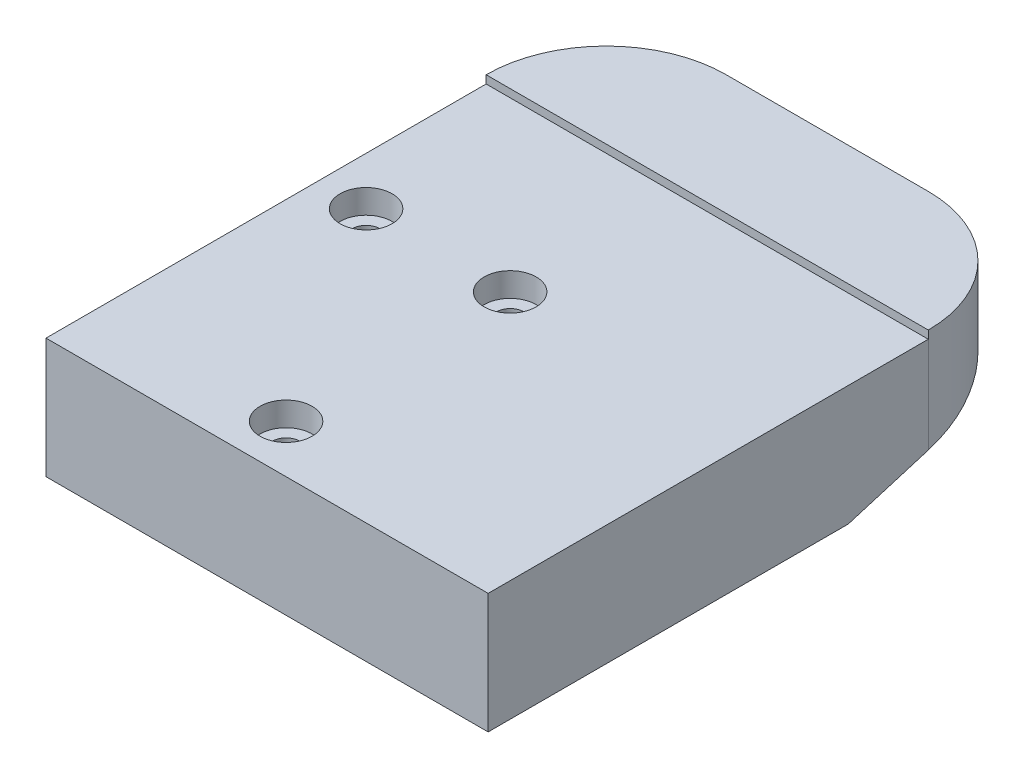
ISO-10303-21;
HEADER;
FILE_DESCRIPTION(('STEP AP214'),'2;1');
FILE_NAME('part.step','',(''),(''),'','','');
FILE_SCHEMA(('AUTOMOTIVE_DESIGN { 1 0 10303 214 1 1 1 1 }'));
ENDSEC;
DATA;
#1=APPLICATION_CONTEXT('core data for automotive mechanical design processes');
#2=APPLICATION_PROTOCOL_DEFINITION('international standard','automotive_design',2000,#1);
#3=PRODUCT_CONTEXT('',#1,'mechanical');
#4=PRODUCT('Part','Part','',(#3));
#5=PRODUCT_RELATED_PRODUCT_CATEGORY('part','',(#4));
#6=PRODUCT_DEFINITION_FORMATION('','',#4);
#7=PRODUCT_DEFINITION_CONTEXT('part definition',#1,'design');
#8=PRODUCT_DEFINITION('design','',#6,#7);
#9=PRODUCT_DEFINITION_SHAPE('','',#8);
#10=(LENGTH_UNIT() NAMED_UNIT(*) SI_UNIT(.MILLI.,.METRE.));
#11=(NAMED_UNIT(*) PLANE_ANGLE_UNIT() SI_UNIT($,.RADIAN.));
#12=(NAMED_UNIT(*) SI_UNIT($,.STERADIAN.) SOLID_ANGLE_UNIT());
#13=UNCERTAINTY_MEASURE_WITH_UNIT(LENGTH_MEASURE(1.E-05),#10,'distance_accuracy_value','');
#14=(GEOMETRIC_REPRESENTATION_CONTEXT(3) GLOBAL_UNCERTAINTY_ASSIGNED_CONTEXT((#13)) GLOBAL_UNIT_ASSIGNED_CONTEXT((#10,
#11,#12)) REPRESENTATION_CONTEXT('',''));
#15=CARTESIAN_POINT('',(0.,0.,0.));
#16=DIRECTION('',(0.,0.,1.));
#17=DIRECTION('',(1.,0.,0.));
#18=AXIS2_PLACEMENT_3D('',#15,#16,#17);
#19=CARTESIAN_POINT('',(15.,15.,-55.));
#20=DIRECTION('',(0.,-1.,0.));
#21=DIRECTION('',(0.,0.,-1.));
#22=AXIS2_PLACEMENT_3D('',#19,#20,#21);
#23=PLANE('',#22);
#24=CARTESIAN_POINT('',(24.,15.,-6.00000000000001));
#25=DIRECTION('',(0.,1.,0.));
#26=DIRECTION('',(0.,0.,1.));
#27=AXIS2_PLACEMENT_3D('',#24,#25,#26);
#28=CIRCLE('',#27,3.25);
#29=CARTESIAN_POINT('',(24.,15.,-2.75000000000001));
#30=VERTEX_POINT('',#29);
#31=EDGE_CURVE('E182',#30,#30,#28,.T.);
#32=ORIENTED_EDGE('',*,*,#31,.F.);
#33=EDGE_LOOP('',(#32));
#34=FACE_BOUND('',#33,.T.);
#35=CARTESIAN_POINT('',(24.,15.,-34.));
#36=DIRECTION('',(0.,1.,0.));
#37=DIRECTION('',(0.,0.,1.));
#38=AXIS2_PLACEMENT_3D('',#35,#36,#37);
#39=CIRCLE('',#38,3.25);
#40=CARTESIAN_POINT('',(24.,15.,-30.75));
#41=VERTEX_POINT('',#40);
#42=EDGE_CURVE('E170',#41,#41,#39,.T.);
#43=ORIENTED_EDGE('',*,*,#42,.F.);
#44=EDGE_LOOP('',(#43));
#45=FACE_BOUND('',#44,.T.);
#46=CARTESIAN_POINT('',(6.,15.,-34.));
#47=DIRECTION('',(0.,1.,0.));
#48=DIRECTION('',(0.,0.,1.));
#49=AXIS2_PLACEMENT_3D('',#46,#47,#48);
#50=CIRCLE('',#49,3.25);
#51=CARTESIAN_POINT('',(6.,15.,-30.75));
#52=VERTEX_POINT('',#51);
#53=EDGE_CURVE('E157',#52,#52,#50,.T.);
#54=ORIENTED_EDGE('',*,*,#53,.F.);
#55=EDGE_LOOP('',(#54));
#56=FACE_BOUND('',#55,.T.);
#57=DIRECTION('',(1.,0.,0.));
#58=VECTOR('',#57,1.);
#59=CARTESIAN_POINT('',(0.,15.,-55.));
#60=LINE('',#59,#58);
#61=CARTESIAN_POINT('',(0.,15.,-54.9999999999999));
#62=VERTEX_POINT('',#61);
#63=CARTESIAN_POINT('',(55.25,15.,-54.9999999999999));
#64=VERTEX_POINT('',#63);
#65=EDGE_CURVE('E68',#62,#64,#60,.T.);
#66=ORIENTED_EDGE('',*,*,#65,.F.);
#67=DIRECTION('',(0.,0.,1.));
#68=VECTOR('',#67,1.);
#69=CARTESIAN_POINT('',(0.,15.,0.));
#70=LINE('',#69,#68);
#71=CARTESIAN_POINT('',(0.,15.,0.));
#72=VERTEX_POINT('',#71);
#73=EDGE_CURVE('E195',#62,#72,#70,.T.);
#74=ORIENTED_EDGE('',*,*,#73,.T.);
#75=DIRECTION('',(1.,0.,0.));
#76=VECTOR('',#75,1.);
#77=CARTESIAN_POINT('',(0.,15.,0.));
#78=LINE('',#77,#76);
#79=CARTESIAN_POINT('',(55.25,15.,0.));
#80=VERTEX_POINT('',#79);
#81=EDGE_CURVE('E86',#72,#80,#78,.T.);
#82=ORIENTED_EDGE('',*,*,#81,.T.);
#83=DIRECTION('',(0.,0.,-1.));
#84=VECTOR('',#83,1.);
#85=CARTESIAN_POINT('',(55.25,15.,0.));
#86=LINE('',#85,#84);
#87=EDGE_CURVE('E199',#80,#64,#86,.T.);
#88=ORIENTED_EDGE('',*,*,#87,.T.);
#89=EDGE_LOOP('',(#66,#74,#82,#88));
#90=FACE_BOUND('',#89,.T.);
#91=ADVANCED_FACE('F44',(#34,#45,#56,#90),#23,.F.);
#92=CARTESIAN_POINT('',(15.,0.,-55.));
#93=DIRECTION('',(0.,-1.,0.));
#94=DIRECTION('',(0.,0.,-1.));
#95=AXIS2_PLACEMENT_3D('',#92,#93,#94);
#96=PLANE('',#95);
#97=DIRECTION('',(-1.,0.,0.));
#98=VECTOR('',#97,1.);
#99=CARTESIAN_POINT('',(55.251,0.,-45.));
#100=LINE('',#99,#98);
#101=CARTESIAN_POINT('',(55.25,0.,-45.));
#102=VERTEX_POINT('',#101);
#103=CARTESIAN_POINT('',(0.,0.,-45.));
#104=VERTEX_POINT('',#103);
#105=EDGE_CURVE('E153',#102,#104,#100,.T.);
#106=ORIENTED_EDGE('',*,*,#105,.F.);
#107=DIRECTION('',(0.,0.,-1.));
#108=VECTOR('',#107,1.);
#109=CARTESIAN_POINT('',(55.25,0.,0.));
#110=LINE('',#109,#108);
#111=CARTESIAN_POINT('',(55.25,0.,0.));
#112=VERTEX_POINT('',#111);
#113=EDGE_CURVE('E197',#112,#102,#110,.T.);
#114=ORIENTED_EDGE('',*,*,#113,.F.);
#115=DIRECTION('',(1.,0.,0.));
#116=VECTOR('',#115,1.);
#117=CARTESIAN_POINT('',(0.,0.,0.));
#118=LINE('',#117,#116);
#119=CARTESIAN_POINT('',(0.,0.,0.));
#120=VERTEX_POINT('',#119);
#121=EDGE_CURVE('E83',#120,#112,#118,.T.);
#122=ORIENTED_EDGE('',*,*,#121,.F.);
#123=DIRECTION('',(0.,0.,1.));
#124=VECTOR('',#123,1.);
#125=CARTESIAN_POINT('',(0.,0.,0.));
#126=LINE('',#125,#124);
#127=EDGE_CURVE('E194',#104,#120,#126,.T.);
#128=ORIENTED_EDGE('',*,*,#127,.F.);
#129=EDGE_LOOP('',(#106,#114,#122,#128));
#130=FACE_BOUND('',#129,.T.);
#131=CARTESIAN_POINT('',(6.,0.,-34.));
#132=DIRECTION('',(0.,1.,0.));
#133=DIRECTION('',(0.,0.,1.));
#134=AXIS2_PLACEMENT_3D('',#131,#132,#133);
#135=CIRCLE('',#134,1.7);
#136=CARTESIAN_POINT('',(6.,0.,-32.3));
#137=VERTEX_POINT('',#136);
#138=EDGE_CURVE('E167',#137,#137,#135,.T.);
#139=ORIENTED_EDGE('',*,*,#138,.T.);
#140=EDGE_LOOP('',(#139));
#141=FACE_BOUND('',#140,.T.);
#142=CARTESIAN_POINT('',(24.,0.,-34.));
#143=DIRECTION('',(0.,1.,0.));
#144=DIRECTION('',(0.,0.,1.));
#145=AXIS2_PLACEMENT_3D('',#142,#143,#144);
#146=CIRCLE('',#145,1.7);
#147=CARTESIAN_POINT('',(24.,0.,-32.3));
#148=VERTEX_POINT('',#147);
#149=EDGE_CURVE('E179',#148,#148,#146,.T.);
#150=ORIENTED_EDGE('',*,*,#149,.T.);
#151=EDGE_LOOP('',(#150));
#152=FACE_BOUND('',#151,.T.);
#153=CARTESIAN_POINT('',(24.,0.,-6.00000000000001));
#154=DIRECTION('',(0.,1.,0.));
#155=DIRECTION('',(0.,0.,1.));
#156=AXIS2_PLACEMENT_3D('',#153,#154,#155);
#157=CIRCLE('',#156,1.7);
#158=CARTESIAN_POINT('',(24.,0.,-4.30000000000002));
#159=VERTEX_POINT('',#158);
#160=EDGE_CURVE('E191',#159,#159,#157,.T.);
#161=ORIENTED_EDGE('',*,*,#160,.T.);
#162=EDGE_LOOP('',(#161));
#163=FACE_BOUND('',#162,.T.);
#164=ADVANCED_FACE('F220',(#130,#141,#152,#163),#96,.T.);
#165=CARTESIAN_POINT('',(0.,15.,0.));
#166=DIRECTION('',(1.,0.,0.));
#167=DIRECTION('',(0.,0.,-1.));
#168=AXIS2_PLACEMENT_3D('',#165,#166,#167);
#169=PLANE('',#168);
#170=DIRECTION('',(0.,-1.,0.));
#171=VECTOR('',#170,1.);
#172=CARTESIAN_POINT('',(0.,15.,-54.9999999999999));
#173=LINE('',#172,#171);
#174=CARTESIAN_POINT('',(0.,3.,-54.9999999999999));
#175=VERTEX_POINT('',#174);
#176=EDGE_CURVE('E140',#62,#175,#173,.T.);
#177=ORIENTED_EDGE('',*,*,#176,.T.);
#178=DIRECTION('',(0.,0.287347885566345,-0.957826285221151));
#179=VECTOR('',#178,1.);
#180=CARTESIAN_POINT('',(0.,0.,-45.));
#181=LINE('',#180,#179);
#182=EDGE_CURVE('E59',#104,#175,#181,.T.);
#183=ORIENTED_EDGE('',*,*,#182,.F.);
#184=ORIENTED_EDGE('',*,*,#127,.T.);
#185=DIRECTION('',(0.,-1.,0.));
#186=VECTOR('',#185,1.);
#187=CARTESIAN_POINT('',(0.,15.,0.));
#188=LINE('',#187,#186);
#189=EDGE_CURVE('E11',#72,#120,#188,.T.);
#190=ORIENTED_EDGE('',*,*,#189,.F.);
#191=ORIENTED_EDGE('',*,*,#73,.F.);
#192=EDGE_LOOP('',(#177,#183,#184,#190,#191));
#193=FACE_BOUND('',#192,.T.);
#194=ADVANCED_FACE('F46',(#193),#169,.F.);
#195=CARTESIAN_POINT('',(0.,15.,0.));
#196=DIRECTION('',(0.,0.,-1.));
#197=DIRECTION('',(-1.,0.,0.));
#198=AXIS2_PLACEMENT_3D('',#195,#196,#197);
#199=PLANE('',#198);
#200=ORIENTED_EDGE('',*,*,#121,.T.);
#201=DIRECTION('',(0.,-1.,0.));
#202=VECTOR('',#201,1.);
#203=CARTESIAN_POINT('',(55.25,15.,0.));
#204=LINE('',#203,#202);
#205=EDGE_CURVE('E52',#80,#112,#204,.T.);
#206=ORIENTED_EDGE('',*,*,#205,.F.);
#207=ORIENTED_EDGE('',*,*,#81,.F.);
#208=ORIENTED_EDGE('',*,*,#189,.T.);
#209=EDGE_LOOP('',(#200,#206,#207,#208));
#210=FACE_BOUND('',#209,.T.);
#211=ADVANCED_FACE('F367',(#210),#199,.F.);
#212=CARTESIAN_POINT('',(55.25,15.,0.));
#213=DIRECTION('',(-1.,0.,0.));
#214=DIRECTION('',(0.,0.,1.));
#215=AXIS2_PLACEMENT_3D('',#212,#213,#214);
#216=PLANE('',#215);
#217=ORIENTED_EDGE('',*,*,#113,.T.);
#218=DIRECTION('',(0.,-0.287347885566345,0.957826285221152));
#219=VECTOR('',#218,1.);
#220=CARTESIAN_POINT('',(55.25,0.,-45.));
#221=LINE('',#220,#219);
#222=CARTESIAN_POINT('',(55.25,2.99999999999997,-54.9999999999999));
#223=VERTEX_POINT('',#222);
#224=EDGE_CURVE('E150',#223,#102,#221,.T.);
#225=ORIENTED_EDGE('',*,*,#224,.F.);
#226=DIRECTION('',(0.,-1.,0.));
#227=VECTOR('',#226,1.);
#228=CARTESIAN_POINT('',(55.25,15.,-54.9999999999999));
#229=LINE('',#228,#227);
#230=EDGE_CURVE('E211',#64,#223,#229,.T.);
#231=ORIENTED_EDGE('',*,*,#230,.F.);
#232=ORIENTED_EDGE('',*,*,#87,.F.);
#233=ORIENTED_EDGE('',*,*,#205,.T.);
#234=EDGE_LOOP('',(#217,#225,#231,#232,#233));
#235=FACE_BOUND('',#234,.T.);
#236=ADVANCED_FACE('F216',(#235),#216,.F.);
#237=CARTESIAN_POINT('',(40.25,15.,-55.));
#238=DIRECTION('',(0.,-1.,0.));
#239=DIRECTION('',(0.,0.,-1.));
#240=AXIS2_PLACEMENT_3D('',#237,#238,#239);
#241=CYLINDRICAL_SURFACE('',#240,15.);
#242=ORIENTED_EDGE('',*,*,#230,.T.);
#243=CARTESIAN_POINT('',(40.25,3.,-55.));
#244=DIRECTION('',(0.,0.957826285221151,0.287347885566345));
#245=DIRECTION('',(0.,-0.287347885566345,0.957826285221152));
#246=AXIS2_PLACEMENT_3D('',#243,#244,#245);
#247=ELLIPSE('',#246,15.6604597633658,15.);
#248=CARTESIAN_POINT('',(40.2499999999999,7.5,-70.));
#249=VERTEX_POINT('',#248);
#250=EDGE_CURVE('E144',#249,#223,#247,.F.);
#251=ORIENTED_EDGE('',*,*,#250,.F.);
#252=DIRECTION('',(0.,-1.,0.));
#253=VECTOR('',#252,1.);
#254=CARTESIAN_POINT('',(40.2499999999999,15.,-70.));
#255=LINE('',#254,#253);
#256=CARTESIAN_POINT('',(40.2499999999999,16.,-70.));
#257=VERTEX_POINT('',#256);
#258=EDGE_CURVE('E208',#257,#249,#255,.T.);
#259=ORIENTED_EDGE('',*,*,#258,.F.);
#260=CARTESIAN_POINT('',(40.25,16.,-55.));
#261=DIRECTION('',(0.,1.,0.));
#262=DIRECTION('',(0.,0.,1.));
#263=AXIS2_PLACEMENT_3D('',#260,#261,#262);
#264=CIRCLE('',#263,15.);
#265=CARTESIAN_POINT('',(55.25,16.,-54.9999999999999));
#266=VERTEX_POINT('',#265);
#267=EDGE_CURVE('E127',#266,#257,#264,.T.);
#268=ORIENTED_EDGE('',*,*,#267,.F.);
#269=DIRECTION('',(0.,-1.,0.));
#270=VECTOR('',#269,1.);
#271=CARTESIAN_POINT('',(55.25,16.,-54.9999999999999));
#272=LINE('',#271,#270);
#273=EDGE_CURVE('E123',#266,#64,#272,.T.);
#274=ORIENTED_EDGE('',*,*,#273,.T.);
#275=EDGE_LOOP('',(#242,#251,#259,#268,#274));
#276=FACE_BOUND('',#275,.T.);
#277=ADVANCED_FACE('F227',(#276),#241,.T.);
#278=CARTESIAN_POINT('',(15.0000000000001,15.,-70.));
#279=DIRECTION('',(0.,0.,1.));
#280=DIRECTION('',(1.,0.,0.));
#281=AXIS2_PLACEMENT_3D('',#278,#279,#280);
#282=PLANE('',#281);
#283=ORIENTED_EDGE('',*,*,#258,.T.);
#284=DIRECTION('',(-1.,0.,0.));
#285=VECTOR('',#284,1.);
#286=CARTESIAN_POINT('',(55.251,7.5,-70.));
#287=LINE('',#286,#285);
#288=CARTESIAN_POINT('',(15.,7.5,-70.));
#289=VERTEX_POINT('',#288);
#290=EDGE_CURVE('E154',#249,#289,#287,.T.);
#291=ORIENTED_EDGE('',*,*,#290,.T.);
#292=DIRECTION('',(0.,-1.,0.));
#293=VECTOR('',#292,1.);
#294=CARTESIAN_POINT('',(15.0000000000001,15.,-70.));
#295=LINE('',#294,#293);
#296=CARTESIAN_POINT('',(15.0000000000001,16.,-70.));
#297=VERTEX_POINT('',#296);
#298=EDGE_CURVE('E206',#297,#289,#295,.T.);
#299=ORIENTED_EDGE('',*,*,#298,.F.);
#300=DIRECTION('',(-1.,0.,0.));
#301=VECTOR('',#300,1.);
#302=CARTESIAN_POINT('',(0.,16.,-70.));
#303=LINE('',#302,#301);
#304=EDGE_CURVE('E134',#257,#297,#303,.T.);
#305=ORIENTED_EDGE('',*,*,#304,.F.);
#306=EDGE_LOOP('',(#283,#291,#299,#305));
#307=FACE_BOUND('',#306,.T.);
#308=ADVANCED_FACE('F232',(#307),#282,.F.);
#309=CARTESIAN_POINT('',(15.,15.,-55.));
#310=DIRECTION('',(0.,-1.,0.));
#311=DIRECTION('',(0.,0.,-1.));
#312=AXIS2_PLACEMENT_3D('',#309,#310,#311);
#313=CYLINDRICAL_SURFACE('',#312,15.);
#314=ORIENTED_EDGE('',*,*,#298,.T.);
#315=CARTESIAN_POINT('',(15.,3.,-55.));
#316=DIRECTION('',(0.,0.957826285221151,0.287347885566345));
#317=DIRECTION('',(0.,-0.287347885566345,0.957826285221152));
#318=AXIS2_PLACEMENT_3D('',#315,#316,#317);
#319=ELLIPSE('',#318,15.6604597633658,15.);
#320=EDGE_CURVE('E142',#175,#289,#319,.F.);
#321=ORIENTED_EDGE('',*,*,#320,.F.);
#322=ORIENTED_EDGE('',*,*,#176,.F.);
#323=DIRECTION('',(0.,-1.,0.));
#324=VECTOR('',#323,1.);
#325=CARTESIAN_POINT('',(0.,16.,-54.9999999999999));
#326=LINE('',#325,#324);
#327=CARTESIAN_POINT('',(0.,16.,-54.9999999999999));
#328=VERTEX_POINT('',#327);
#329=EDGE_CURVE('E121',#328,#62,#326,.T.);
#330=ORIENTED_EDGE('',*,*,#329,.F.);
#331=CARTESIAN_POINT('',(15.,16.,-55.));
#332=DIRECTION('',(0.,1.,0.));
#333=DIRECTION('',(0.,0.,1.));
#334=AXIS2_PLACEMENT_3D('',#331,#332,#333);
#335=CIRCLE('',#334,15.);
#336=EDGE_CURVE('E128',#297,#328,#335,.T.);
#337=ORIENTED_EDGE('',*,*,#336,.F.);
#338=EDGE_LOOP('',(#314,#321,#322,#330,#337));
#339=FACE_BOUND('',#338,.T.);
#340=ADVANCED_FACE('F138',(#339),#313,.T.);
#341=CARTESIAN_POINT('',(24.,15.,-6.00000000000001));
#342=DIRECTION('',(0.,1.,0.));
#343=DIRECTION('',(0.,0.,1.));
#344=AXIS2_PLACEMENT_3D('',#341,#342,#343);
#345=CYLINDRICAL_SURFACE('',#344,1.7);
#346=ORIENTED_EDGE('',*,*,#160,.F.);
#347=EDGE_LOOP('',(#346));
#348=FACE_BOUND('',#347,.T.);
#349=CARTESIAN_POINT('',(24.,12.,-6.00000000000001));
#350=DIRECTION('',(0.,1.,0.));
#351=DIRECTION('',(0.,0.,1.));
#352=AXIS2_PLACEMENT_3D('',#349,#350,#351);
#353=CIRCLE('',#352,1.7);
#354=CARTESIAN_POINT('',(24.,12.,-4.30000000000001));
#355=VERTEX_POINT('',#354);
#356=EDGE_CURVE('E188',#355,#355,#353,.T.);
#357=ORIENTED_EDGE('',*,*,#356,.T.);
#358=EDGE_LOOP('',(#357));
#359=FACE_BOUND('',#358,.T.);
#360=ADVANCED_FACE('F239',(#348,#359),#345,.F.);
#361=CARTESIAN_POINT('',(25.7,12.,-6.00000000000001));
#362=DIRECTION('',(0.,-1.,0.));
#363=DIRECTION('',(0.,0.,-1.));
#364=AXIS2_PLACEMENT_3D('',#361,#362,#363);
#365=PLANE('',#364);
#366=ORIENTED_EDGE('',*,*,#356,.F.);
#367=EDGE_LOOP('',(#366));
#368=FACE_BOUND('',#367,.T.);
#369=CARTESIAN_POINT('',(24.,12.,-6.00000000000001));
#370=DIRECTION('',(0.,1.,0.));
#371=DIRECTION('',(0.,0.,1.));
#372=AXIS2_PLACEMENT_3D('',#369,#370,#371);
#373=CIRCLE('',#372,3.25);
#374=CARTESIAN_POINT('',(24.,12.,-2.75000000000001));
#375=VERTEX_POINT('',#374);
#376=EDGE_CURVE('E185',#375,#375,#373,.T.);
#377=ORIENTED_EDGE('',*,*,#376,.T.);
#378=EDGE_LOOP('',(#377));
#379=FACE_BOUND('',#378,.T.);
#380=ADVANCED_FACE('F254',(#368,#379),#365,.F.);
#381=CARTESIAN_POINT('',(24.,15.,-6.00000000000001));
#382=DIRECTION('',(0.,1.,0.));
#383=DIRECTION('',(0.,0.,1.));
#384=AXIS2_PLACEMENT_3D('',#381,#382,#383);
#385=CYLINDRICAL_SURFACE('',#384,3.25);
#386=ORIENTED_EDGE('',*,*,#376,.F.);
#387=EDGE_LOOP('',(#386));
#388=FACE_BOUND('',#387,.T.);
#389=ORIENTED_EDGE('',*,*,#31,.T.);
#390=EDGE_LOOP('',(#389));
#391=FACE_BOUND('',#390,.T.);
#392=ADVANCED_FACE('F258',(#388,#391),#385,.F.);
#393=CARTESIAN_POINT('',(24.,15.,-34.));
#394=DIRECTION('',(0.,1.,0.));
#395=DIRECTION('',(0.,0.,1.));
#396=AXIS2_PLACEMENT_3D('',#393,#394,#395);
#397=CYLINDRICAL_SURFACE('',#396,1.7);
#398=ORIENTED_EDGE('',*,*,#149,.F.);
#399=EDGE_LOOP('',(#398));
#400=FACE_BOUND('',#399,.T.);
#401=CARTESIAN_POINT('',(24.,12.,-34.));
#402=DIRECTION('',(0.,1.,0.));
#403=DIRECTION('',(0.,0.,1.));
#404=AXIS2_PLACEMENT_3D('',#401,#402,#403);
#405=CIRCLE('',#404,1.7);
#406=CARTESIAN_POINT('',(24.,12.,-32.3));
#407=VERTEX_POINT('',#406);
#408=EDGE_CURVE('E176',#407,#407,#405,.T.);
#409=ORIENTED_EDGE('',*,*,#408,.T.);
#410=EDGE_LOOP('',(#409));
#411=FACE_BOUND('',#410,.T.);
#412=ADVANCED_FACE('F262',(#400,#411),#397,.F.);
#413=CARTESIAN_POINT('',(25.7,12.,-34.));
#414=DIRECTION('',(0.,-1.,0.));
#415=DIRECTION('',(0.,0.,-1.));
#416=AXIS2_PLACEMENT_3D('',#413,#414,#415);
#417=PLANE('',#416);
#418=ORIENTED_EDGE('',*,*,#408,.F.);
#419=EDGE_LOOP('',(#418));
#420=FACE_BOUND('',#419,.T.);
#421=CARTESIAN_POINT('',(24.,12.,-34.));
#422=DIRECTION('',(0.,1.,0.));
#423=DIRECTION('',(0.,0.,1.));
#424=AXIS2_PLACEMENT_3D('',#421,#422,#423);
#425=CIRCLE('',#424,3.25);
#426=CARTESIAN_POINT('',(24.,12.,-30.75));
#427=VERTEX_POINT('',#426);
#428=EDGE_CURVE('E173',#427,#427,#425,.T.);
#429=ORIENTED_EDGE('',*,*,#428,.T.);
#430=EDGE_LOOP('',(#429));
#431=FACE_BOUND('',#430,.T.);
#432=ADVANCED_FACE('F266',(#420,#431),#417,.F.);
#433=CARTESIAN_POINT('',(24.,15.,-34.));
#434=DIRECTION('',(0.,1.,0.));
#435=DIRECTION('',(0.,0.,1.));
#436=AXIS2_PLACEMENT_3D('',#433,#434,#435);
#437=CYLINDRICAL_SURFACE('',#436,3.25);
#438=ORIENTED_EDGE('',*,*,#428,.F.);
#439=EDGE_LOOP('',(#438));
#440=FACE_BOUND('',#439,.T.);
#441=ORIENTED_EDGE('',*,*,#42,.T.);
#442=EDGE_LOOP('',(#441));
#443=FACE_BOUND('',#442,.T.);
#444=ADVANCED_FACE('F270',(#440,#443),#437,.F.);
#445=CARTESIAN_POINT('',(6.,15.,-34.));
#446=DIRECTION('',(0.,1.,0.));
#447=DIRECTION('',(0.,0.,1.));
#448=AXIS2_PLACEMENT_3D('',#445,#446,#447);
#449=CYLINDRICAL_SURFACE('',#448,1.7);
#450=ORIENTED_EDGE('',*,*,#138,.F.);
#451=EDGE_LOOP('',(#450));
#452=FACE_BOUND('',#451,.T.);
#453=CARTESIAN_POINT('',(6.,12.,-34.));
#454=DIRECTION('',(0.,1.,0.));
#455=DIRECTION('',(0.,0.,1.));
#456=AXIS2_PLACEMENT_3D('',#453,#454,#455);
#457=CIRCLE('',#456,1.7);
#458=CARTESIAN_POINT('',(6.,12.,-32.3));
#459=VERTEX_POINT('',#458);
#460=EDGE_CURVE('E164',#459,#459,#457,.T.);
#461=ORIENTED_EDGE('',*,*,#460,.T.);
#462=EDGE_LOOP('',(#461));
#463=FACE_BOUND('',#462,.T.);
#464=ADVANCED_FACE('F274',(#452,#463),#449,.F.);
#465=CARTESIAN_POINT('',(7.7,12.,-34.));
#466=DIRECTION('',(0.,-1.,0.));
#467=DIRECTION('',(0.,0.,-1.));
#468=AXIS2_PLACEMENT_3D('',#465,#466,#467);
#469=PLANE('',#468);
#470=ORIENTED_EDGE('',*,*,#460,.F.);
#471=EDGE_LOOP('',(#470));
#472=FACE_BOUND('',#471,.T.);
#473=CARTESIAN_POINT('',(6.,12.,-34.));
#474=DIRECTION('',(0.,1.,0.));
#475=DIRECTION('',(0.,0.,1.));
#476=AXIS2_PLACEMENT_3D('',#473,#474,#475);
#477=CIRCLE('',#476,3.25);
#478=CARTESIAN_POINT('',(6.,12.,-30.75));
#479=VERTEX_POINT('',#478);
#480=EDGE_CURVE('E161',#479,#479,#477,.T.);
#481=ORIENTED_EDGE('',*,*,#480,.T.);
#482=EDGE_LOOP('',(#481));
#483=FACE_BOUND('',#482,.T.);
#484=ADVANCED_FACE('F278',(#472,#483),#469,.F.);
#485=CARTESIAN_POINT('',(6.,15.,-34.));
#486=DIRECTION('',(0.,1.,0.));
#487=DIRECTION('',(0.,0.,1.));
#488=AXIS2_PLACEMENT_3D('',#485,#486,#487);
#489=CYLINDRICAL_SURFACE('',#488,3.25);
#490=ORIENTED_EDGE('',*,*,#480,.F.);
#491=EDGE_LOOP('',(#490));
#492=FACE_BOUND('',#491,.T.);
#493=ORIENTED_EDGE('',*,*,#53,.T.);
#494=EDGE_LOOP('',(#493));
#495=FACE_BOUND('',#494,.T.);
#496=ADVANCED_FACE('F282',(#492,#495),#489,.F.);
#497=CARTESIAN_POINT('',(55.251,0.,-45.));
#498=DIRECTION('',(0.,0.957826285221151,0.287347885566345));
#499=DIRECTION('',(0.,-0.287347885566345,0.957826285221152));
#500=AXIS2_PLACEMENT_3D('',#497,#498,#499);
#501=PLANE('',#500);
#502=ORIENTED_EDGE('',*,*,#224,.T.);
#503=ORIENTED_EDGE('',*,*,#105,.T.);
#504=ORIENTED_EDGE('',*,*,#182,.T.);
#505=ORIENTED_EDGE('',*,*,#320,.T.);
#506=ORIENTED_EDGE('',*,*,#290,.F.);
#507=ORIENTED_EDGE('',*,*,#250,.T.);
#508=EDGE_LOOP('',(#502,#503,#504,#505,#506,#507));
#509=FACE_BOUND('',#508,.T.);
#510=ADVANCED_FACE('F223',(#509),#501,.F.);
#511=CARTESIAN_POINT('',(0.,16.,-55.));
#512=DIRECTION('',(0.,0.,-1.));
#513=DIRECTION('',(-1.,0.,0.));
#514=AXIS2_PLACEMENT_3D('',#511,#512,#513);
#515=PLANE('',#514);
#516=ORIENTED_EDGE('',*,*,#65,.T.);
#517=ORIENTED_EDGE('',*,*,#273,.F.);
#518=DIRECTION('',(1.,0.,0.));
#519=VECTOR('',#518,1.);
#520=CARTESIAN_POINT('',(0.,16.,-55.));
#521=LINE('',#520,#519);
#522=EDGE_CURVE('E117',#328,#266,#521,.T.);
#523=ORIENTED_EDGE('',*,*,#522,.F.);
#524=ORIENTED_EDGE('',*,*,#329,.T.);
#525=EDGE_LOOP('',(#516,#517,#523,#524));
#526=FACE_BOUND('',#525,.T.);
#527=ADVANCED_FACE('F119',(#526),#515,.F.);
#528=CARTESIAN_POINT('',(0.,16.,0.));
#529=DIRECTION('',(0.,1.,0.));
#530=DIRECTION('',(0.,0.,1.));
#531=AXIS2_PLACEMENT_3D('',#528,#529,#530);
#532=PLANE('',#531);
#533=ORIENTED_EDGE('',*,*,#336,.T.);
#534=ORIENTED_EDGE('',*,*,#522,.T.);
#535=ORIENTED_EDGE('',*,*,#267,.T.);
#536=ORIENTED_EDGE('',*,*,#304,.T.);
#537=EDGE_LOOP('',(#533,#534,#535,#536));
#538=FACE_BOUND('',#537,.T.);
#539=ADVANCED_FACE('F132',(#538),#532,.T.);
#540=CLOSED_SHELL('',(#91,#164,#194,#211,#236,#277,#308,#340,#360,#380,#392,#412,#432,#444,#464,
#484,#496,#510,#527,#539));
#541=MANIFOLD_SOLID_BREP('B2',#540);
#542=ADVANCED_BREP_SHAPE_REPRESENTATION('',(#18,#541),#14);
#543=SHAPE_DEFINITION_REPRESENTATION(#9,#542);
ENDSEC;
END-ISO-10303-21;
